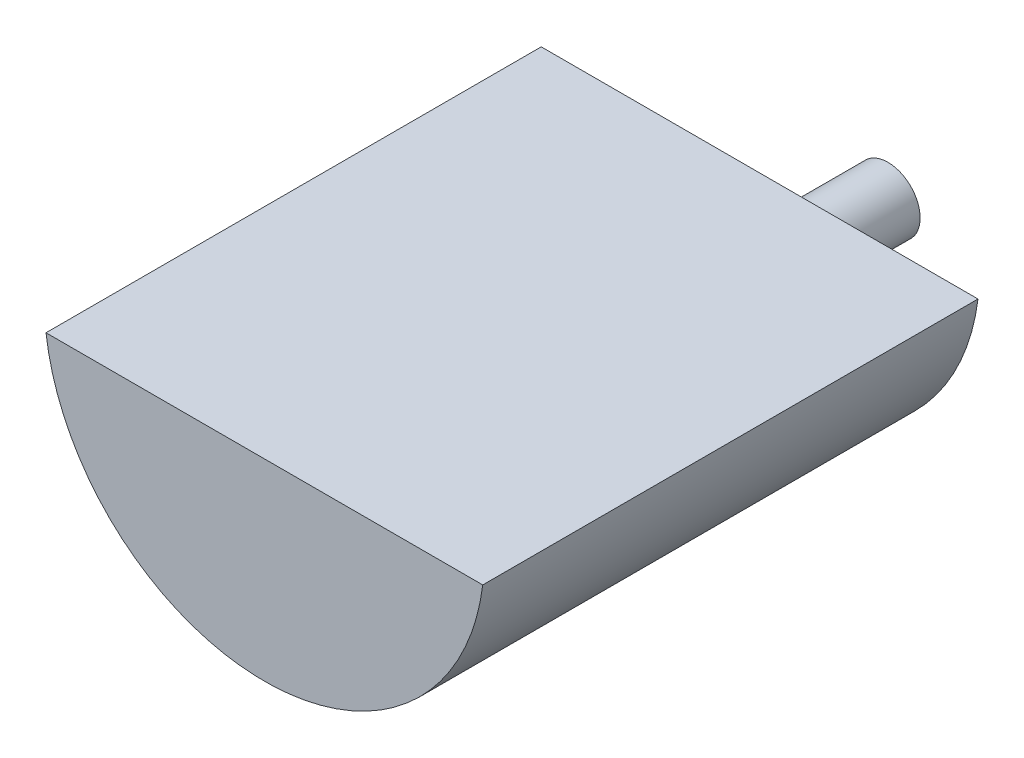
ISO-10303-21;
HEADER;
FILE_DESCRIPTION(('STEP AP214'),'2;1');
FILE_NAME('part.step','',(''),(''),'','','');
FILE_SCHEMA(('AUTOMOTIVE_DESIGN { 1 0 10303 214 1 1 1 1 }'));
ENDSEC;
DATA;
#1=APPLICATION_CONTEXT('core data for automotive mechanical design processes');
#2=APPLICATION_PROTOCOL_DEFINITION('international standard','automotive_design',2000,#1);
#3=PRODUCT_CONTEXT('',#1,'mechanical');
#4=PRODUCT('Part','Part','',(#3));
#5=PRODUCT_RELATED_PRODUCT_CATEGORY('part','',(#4));
#6=PRODUCT_DEFINITION_FORMATION('','',#4);
#7=PRODUCT_DEFINITION_CONTEXT('part definition',#1,'design');
#8=PRODUCT_DEFINITION('design','',#6,#7);
#9=PRODUCT_DEFINITION_SHAPE('','',#8);
#10=(LENGTH_UNIT() NAMED_UNIT(*) SI_UNIT(.MILLI.,.METRE.));
#11=(NAMED_UNIT(*) PLANE_ANGLE_UNIT() SI_UNIT($,.RADIAN.));
#12=(NAMED_UNIT(*) SI_UNIT($,.STERADIAN.) SOLID_ANGLE_UNIT());
#13=UNCERTAINTY_MEASURE_WITH_UNIT(LENGTH_MEASURE(1.E-05),#10,'distance_accuracy_value','');
#14=(GEOMETRIC_REPRESENTATION_CONTEXT(3) GLOBAL_UNCERTAINTY_ASSIGNED_CONTEXT((#13)) GLOBAL_UNIT_ASSIGNED_CONTEXT((#10,
#11,#12)) REPRESENTATION_CONTEXT('',''));
#15=CARTESIAN_POINT('',(0.,0.,0.));
#16=DIRECTION('',(0.,0.,1.));
#17=DIRECTION('',(1.,0.,0.));
#18=AXIS2_PLACEMENT_3D('',#15,#16,#17);
#19=CARTESIAN_POINT('',(0.,0.,3.));
#20=DIRECTION('',(0.,0.,1.));
#21=DIRECTION('',(1.,0.,0.));
#22=AXIS2_PLACEMENT_3D('',#19,#20,#21);
#23=CYLINDRICAL_SURFACE('',#22,21.);
#24=CARTESIAN_POINT('',(0.,0.,51.));
#25=DIRECTION('',(0.,0.,1.));
#26=DIRECTION('',(1.,0.,0.));
#27=AXIS2_PLACEMENT_3D('',#24,#25,#26);
#28=CIRCLE('',#27,21.);
#29=CARTESIAN_POINT('',(-20.1246117974981,-6.,51.));
#30=VERTEX_POINT('',#29);
#31=CARTESIAN_POINT('',(20.1246117974981,-6.,51.));
#32=VERTEX_POINT('',#31);
#33=EDGE_CURVE('E80',#30,#32,#28,.T.);
#34=ORIENTED_EDGE('',*,*,#33,.T.);
#35=DIRECTION('',(0.,0.,1.));
#36=VECTOR('',#35,1.);
#37=CARTESIAN_POINT('',(20.1246117974981,-6.,3.));
#38=LINE('',#37,#36);
#39=CARTESIAN_POINT('',(20.1246117974981,-6.,3.));
#40=VERTEX_POINT('',#39);
#41=EDGE_CURVE('E75',#40,#32,#38,.T.);
#42=ORIENTED_EDGE('',*,*,#41,.F.);
#43=CARTESIAN_POINT('',(0.,0.,3.));
#44=DIRECTION('',(0.,0.,1.));
#45=DIRECTION('',(1.,0.,0.));
#46=AXIS2_PLACEMENT_3D('',#43,#44,#45);
#47=CIRCLE('',#46,21.);
#48=CARTESIAN_POINT('',(-20.1246117974981,-6.,3.));
#49=VERTEX_POINT('',#48);
#50=EDGE_CURVE('E77',#49,#40,#47,.T.);
#51=ORIENTED_EDGE('',*,*,#50,.F.);
#52=DIRECTION('',(0.,0.,1.));
#53=VECTOR('',#52,1.);
#54=CARTESIAN_POINT('',(-20.1246117974981,-6.,3.));
#55=LINE('',#54,#53);
#56=EDGE_CURVE('E85',#49,#30,#55,.T.);
#57=ORIENTED_EDGE('',*,*,#56,.T.);
#58=EDGE_LOOP('',(#34,#42,#51,#57));
#59=FACE_BOUND('',#58,.T.);
#60=ADVANCED_FACE('F35',(#59),#23,.F.);
#61=CARTESIAN_POINT('',(20.1246117974981,-6.,3.));
#62=DIRECTION('',(0.,1.,0.));
#63=DIRECTION('',(0.,0.,1.));
#64=AXIS2_PLACEMENT_3D('',#61,#62,#63);
#65=PLANE('',#64);
#66=DIRECTION('',(-1.,0.,0.));
#67=VECTOR('',#66,1.);
#68=CARTESIAN_POINT('',(20.1246117974981,-6.,51.));
#69=LINE('',#68,#67);
#70=EDGE_CURVE('E90',#32,#30,#69,.T.);
#71=ORIENTED_EDGE('',*,*,#70,.T.);
#72=ORIENTED_EDGE('',*,*,#56,.F.);
#73=DIRECTION('',(-1.,0.,0.));
#74=VECTOR('',#73,1.);
#75=CARTESIAN_POINT('',(20.1246117974981,-6.,3.));
#76=LINE('',#75,#74);
#77=EDGE_CURVE('E86',#40,#49,#76,.T.);
#78=ORIENTED_EDGE('',*,*,#77,.F.);
#79=ORIENTED_EDGE('',*,*,#41,.T.);
#80=EDGE_LOOP('',(#71,#72,#78,#79));
#81=FACE_BOUND('',#80,.T.);
#82=ADVANCED_FACE('F92',(#81),#65,.F.);
#83=CARTESIAN_POINT('',(0.,0.,3.));
#84=DIRECTION('',(0.,0.,1.));
#85=DIRECTION('',(1.,0.,0.));
#86=AXIS2_PLACEMENT_3D('',#83,#84,#85);
#87=PLANE('',#86);
#88=CARTESIAN_POINT('',(0.,-12.5,3.));
#89=DIRECTION('',(0.,0.,-1.));
#90=DIRECTION('',(-1.,0.,0.));
#91=AXIS2_PLACEMENT_3D('',#88,#89,#90);
#92=CIRCLE('',#91,1.);
#93=CARTESIAN_POINT('',(-1.,-12.5,3.));
#94=VERTEX_POINT('',#93);
#95=EDGE_CURVE('E97',#94,#94,#92,.T.);
#96=ORIENTED_EDGE('',*,*,#95,.T.);
#97=EDGE_LOOP('',(#96));
#98=FACE_BOUND('',#97,.T.);
#99=ORIENTED_EDGE('',*,*,#50,.T.);
#100=ORIENTED_EDGE('',*,*,#77,.T.);
#101=EDGE_LOOP('',(#99,#100));
#102=FACE_BOUND('',#101,.T.);
#103=ADVANCED_FACE('F89',(#98,#102),#87,.T.);
#104=CARTESIAN_POINT('',(0.,0.,51.));
#105=DIRECTION('',(0.,0.,1.));
#106=DIRECTION('',(1.,0.,0.));
#107=AXIS2_PLACEMENT_3D('',#104,#105,#106);
#108=PLANE('',#107);
#109=ORIENTED_EDGE('',*,*,#33,.F.);
#110=ORIENTED_EDGE('',*,*,#70,.F.);
#111=EDGE_LOOP('',(#109,#110));
#112=FACE_BOUND('',#111,.T.);
#113=ADVANCED_FACE('F161',(#112),#108,.F.);
#114=CARTESIAN_POINT('',(0.,0.,54.));
#115=DIRECTION('',(0.,0.,-1.));
#116=DIRECTION('',(-1.,0.,0.));
#117=AXIS2_PLACEMENT_3D('',#114,#115,#116);
#118=CYLINDRICAL_SURFACE('',#117,24.);
#119=CARTESIAN_POINT('',(0.,0.,54.));
#120=DIRECTION('',(0.,0.,1.));
#121=DIRECTION('',(1.,0.,0.));
#122=AXIS2_PLACEMENT_3D('',#119,#120,#121);
#123=CIRCLE('',#122,24.);
#124=CARTESIAN_POINT('',(-23.8117617995813,-3.,54.));
#125=VERTEX_POINT('',#124);
#126=CARTESIAN_POINT('',(23.8117617995813,-3.,54.));
#127=VERTEX_POINT('',#126);
#128=EDGE_CURVE('E111',#125,#127,#123,.T.);
#129=ORIENTED_EDGE('',*,*,#128,.F.);
#130=DIRECTION('',(0.,0.,-1.));
#131=VECTOR('',#130,1.);
#132=CARTESIAN_POINT('',(-23.8117617995813,-3.,54.));
#133=LINE('',#132,#131);
#134=CARTESIAN_POINT('',(-23.8117617995813,-3.,0.));
#135=VERTEX_POINT('',#134);
#136=EDGE_CURVE('E55',#125,#135,#133,.T.);
#137=ORIENTED_EDGE('',*,*,#136,.T.);
#138=CARTESIAN_POINT('',(0.,0.,0.));
#139=DIRECTION('',(0.,0.,1.));
#140=DIRECTION('',(1.,0.,0.));
#141=AXIS2_PLACEMENT_3D('',#138,#139,#140);
#142=CIRCLE('',#141,24.);
#143=CARTESIAN_POINT('',(23.8117617995813,-3.,0.));
#144=VERTEX_POINT('',#143);
#145=EDGE_CURVE('E110',#135,#144,#142,.T.);
#146=ORIENTED_EDGE('',*,*,#145,.T.);
#147=DIRECTION('',(0.,0.,-1.));
#148=VECTOR('',#147,1.);
#149=CARTESIAN_POINT('',(23.8117617995813,-3.,54.));
#150=LINE('',#149,#148);
#151=EDGE_CURVE('E50',#144,#127,#150,.F.);
#152=ORIENTED_EDGE('',*,*,#151,.T.);
#153=EDGE_LOOP('',(#129,#137,#146,#152));
#154=FACE_BOUND('',#153,.T.);
#155=ADVANCED_FACE('F37',(#154),#118,.T.);
#156=CARTESIAN_POINT('',(0.,0.,54.));
#157=DIRECTION('',(0.,0.,1.));
#158=DIRECTION('',(1.,0.,0.));
#159=AXIS2_PLACEMENT_3D('',#156,#157,#158);
#160=PLANE('',#159);
#161=DIRECTION('',(-1.,0.,0.));
#162=VECTOR('',#161,1.);
#163=CARTESIAN_POINT('',(47.0081722315641,-3.,54.));
#164=LINE('',#163,#162);
#165=EDGE_CURVE('E106',#127,#125,#164,.T.);
#166=ORIENTED_EDGE('',*,*,#165,.T.);
#167=ORIENTED_EDGE('',*,*,#128,.T.);
#168=EDGE_LOOP('',(#166,#167));
#169=FACE_BOUND('',#168,.T.);
#170=ADVANCED_FACE('F121',(#169),#160,.T.);
#171=CARTESIAN_POINT('',(0.,0.,0.));
#172=DIRECTION('',(0.,0.,1.));
#173=DIRECTION('',(1.,0.,0.));
#174=AXIS2_PLACEMENT_3D('',#171,#172,#173);
#175=PLANE('',#174);
#176=CARTESIAN_POINT('',(0.,-12.5,0.));
#177=DIRECTION('',(0.,0.,1.));
#178=DIRECTION('',(1.,0.,0.));
#179=AXIS2_PLACEMENT_3D('',#176,#177,#178);
#180=CIRCLE('',#179,3.5);
#181=CARTESIAN_POINT('',(3.5,-12.5,0.));
#182=VERTEX_POINT('',#181);
#183=EDGE_CURVE('E11',#182,#182,#180,.F.);
#184=ORIENTED_EDGE('',*,*,#183,.F.);
#185=EDGE_LOOP('',(#184));
#186=FACE_BOUND('',#185,.T.);
#187=ORIENTED_EDGE('',*,*,#145,.F.);
#188=DIRECTION('',(1.,0.,0.));
#189=VECTOR('',#188,1.);
#190=CARTESIAN_POINT('',(0.,-3.,0.));
#191=LINE('',#190,#189);
#192=EDGE_CURVE('E43',#135,#144,#191,.T.);
#193=ORIENTED_EDGE('',*,*,#192,.T.);
#194=EDGE_LOOP('',(#187,#193));
#195=FACE_BOUND('',#194,.T.);
#196=ADVANCED_FACE('F117',(#186,#195),#175,.F.);
#197=CARTESIAN_POINT('',(47.0081722315641,-3.,54.));
#198=DIRECTION('',(0.,-1.,0.));
#199=DIRECTION('',(0.,0.,-1.));
#200=AXIS2_PLACEMENT_3D('',#197,#198,#199);
#201=PLANE('',#200);
#202=ORIENTED_EDGE('',*,*,#165,.F.);
#203=ORIENTED_EDGE('',*,*,#151,.F.);
#204=ORIENTED_EDGE('',*,*,#192,.F.);
#205=ORIENTED_EDGE('',*,*,#136,.F.);
#206=EDGE_LOOP('',(#202,#203,#204,#205));
#207=FACE_BOUND('',#206,.T.);
#208=ADVANCED_FACE('F122',(#207),#201,.F.);
#209=CARTESIAN_POINT('',(0.,-12.5,-14.));
#210=DIRECTION('',(0.,0.,-1.));
#211=DIRECTION('',(-1.,0.,0.));
#212=AXIS2_PLACEMENT_3D('',#209,#210,#211);
#213=PLANE('',#212);
#214=CARTESIAN_POINT('',(0.,-12.5,-14.));
#215=DIRECTION('',(0.,0.,-1.));
#216=DIRECTION('',(-1.,0.,0.));
#217=AXIS2_PLACEMENT_3D('',#214,#215,#216);
#218=CIRCLE('',#217,3.5);
#219=CARTESIAN_POINT('',(-3.5,-12.5,-14.));
#220=VERTEX_POINT('',#219);
#221=EDGE_CURVE('E103',#220,#220,#218,.T.);
#222=ORIENTED_EDGE('',*,*,#221,.T.);
#223=EDGE_LOOP('',(#222));
#224=FACE_BOUND('',#223,.T.);
#225=CARTESIAN_POINT('',(0.,-12.5,-14.));
#226=DIRECTION('',(0.,0.,-1.));
#227=DIRECTION('',(-1.,0.,0.));
#228=AXIS2_PLACEMENT_3D('',#225,#226,#227);
#229=CIRCLE('',#228,1.);
#230=CARTESIAN_POINT('',(-1.,-12.5,-14.));
#231=VERTEX_POINT('',#230);
#232=EDGE_CURVE('E99',#231,#231,#229,.T.);
#233=ORIENTED_EDGE('',*,*,#232,.F.);
#234=EDGE_LOOP('',(#233));
#235=FACE_BOUND('',#234,.T.);
#236=ADVANCED_FACE('F124',(#224,#235),#213,.T.);
#237=CARTESIAN_POINT('',(0.,-12.5,-14.));
#238=DIRECTION('',(0.,0.,1.));
#239=DIRECTION('',(1.,0.,0.));
#240=AXIS2_PLACEMENT_3D('',#237,#238,#239);
#241=CYLINDRICAL_SURFACE('',#240,3.5);
#242=ORIENTED_EDGE('',*,*,#221,.F.);
#243=EDGE_LOOP('',(#242));
#244=FACE_BOUND('',#243,.T.);
#245=ORIENTED_EDGE('',*,*,#183,.T.);
#246=EDGE_LOOP('',(#245));
#247=FACE_BOUND('',#246,.T.);
#248=ADVANCED_FACE('F130',(#244,#247),#241,.T.);
#249=CARTESIAN_POINT('',(0.,-12.5,-14.));
#250=DIRECTION('',(0.,0.,1.));
#251=DIRECTION('',(1.,0.,0.));
#252=AXIS2_PLACEMENT_3D('',#249,#250,#251);
#253=CYLINDRICAL_SURFACE('',#252,1.);
#254=ORIENTED_EDGE('',*,*,#232,.T.);
#255=EDGE_LOOP('',(#254));
#256=FACE_BOUND('',#255,.T.);
#257=ORIENTED_EDGE('',*,*,#95,.F.);
#258=EDGE_LOOP('',(#257));
#259=FACE_BOUND('',#258,.T.);
#260=ADVANCED_FACE('F144',(#256,#259),#253,.F.);
#261=CLOSED_SHELL('',(#60,#82,#103,#113,#155,#170,#196,#208,#236,#248,#260));
#262=MANIFOLD_SOLID_BREP('B2',#261);
#263=ADVANCED_BREP_SHAPE_REPRESENTATION('',(#18,#262),#14);
#264=SHAPE_DEFINITION_REPRESENTATION(#9,#263);
ENDSEC;
END-ISO-10303-21;
